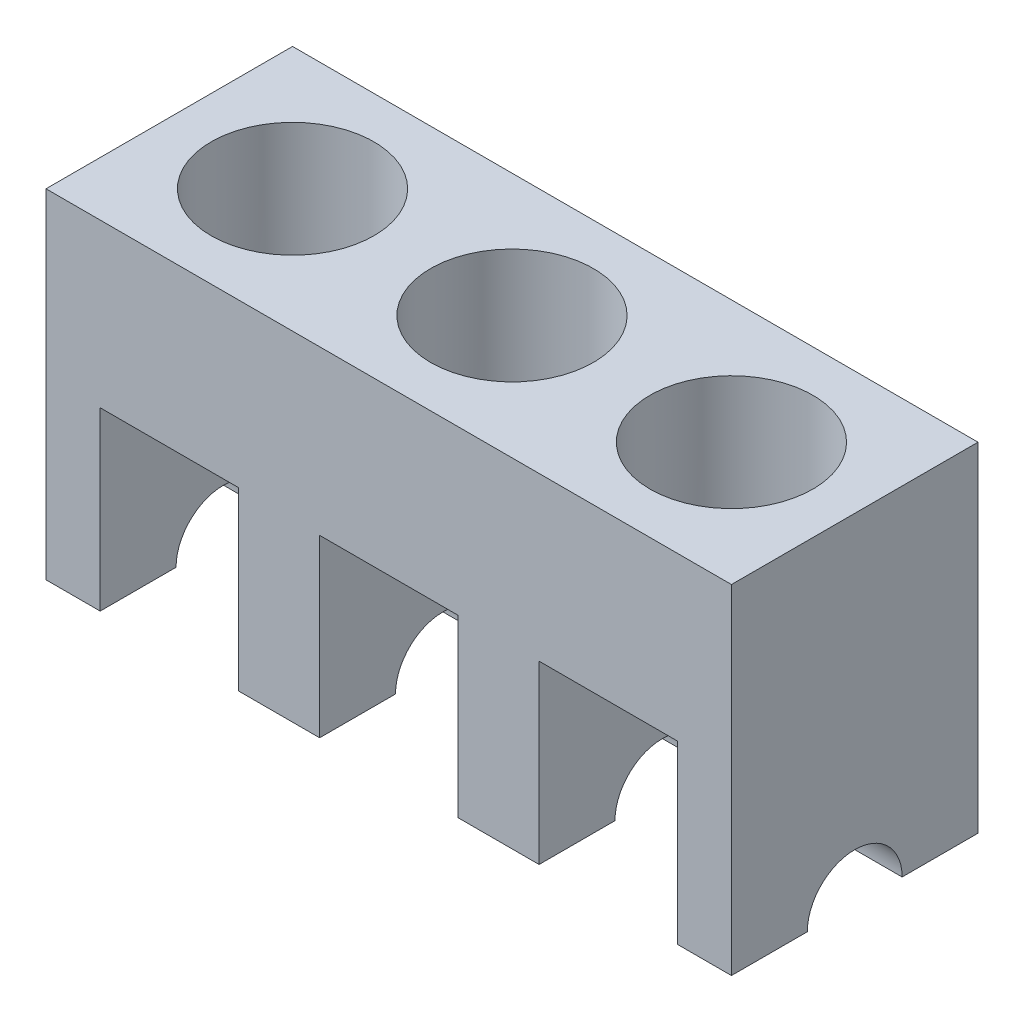
ISO-10303-21;
HEADER;
FILE_DESCRIPTION(('STEP AP214'),'2;1');
FILE_NAME('part.step','',(''),(''),'','','');
FILE_SCHEMA(('AUTOMOTIVE_DESIGN { 1 0 10303 214 1 1 1 1 }'));
ENDSEC;
DATA;
#1=APPLICATION_CONTEXT('core data for automotive mechanical design processes');
#2=APPLICATION_PROTOCOL_DEFINITION('international standard','automotive_design',2000,#1);
#3=PRODUCT_CONTEXT('',#1,'mechanical');
#4=PRODUCT('Part','Part','',(#3));
#5=PRODUCT_RELATED_PRODUCT_CATEGORY('part','',(#4));
#6=PRODUCT_DEFINITION_FORMATION('','',#4);
#7=PRODUCT_DEFINITION_CONTEXT('part definition',#1,'design');
#8=PRODUCT_DEFINITION('design','',#6,#7);
#9=PRODUCT_DEFINITION_SHAPE('','',#8);
#10=(LENGTH_UNIT() NAMED_UNIT(*) SI_UNIT(.MILLI.,.METRE.));
#11=(NAMED_UNIT(*) PLANE_ANGLE_UNIT() SI_UNIT($,.RADIAN.));
#12=(NAMED_UNIT(*) SI_UNIT($,.STERADIAN.) SOLID_ANGLE_UNIT());
#13=UNCERTAINTY_MEASURE_WITH_UNIT(LENGTH_MEASURE(1.E-05),#10,'distance_accuracy_value','');
#14=(GEOMETRIC_REPRESENTATION_CONTEXT(3) GLOBAL_UNCERTAINTY_ASSIGNED_CONTEXT((#13)) GLOBAL_UNIT_ASSIGNED_CONTEXT((#10,
#11,#12)) REPRESENTATION_CONTEXT('',''));
#15=CARTESIAN_POINT('',(0.,0.,0.));
#16=DIRECTION('',(0.,0.,1.));
#17=DIRECTION('',(1.,0.,0.));
#18=AXIS2_PLACEMENT_3D('',#15,#16,#17);
#19=CARTESIAN_POINT('',(0.,0.,0.));
#20=DIRECTION('',(0.,1.,0.));
#21=DIRECTION('',(0.,0.,1.));
#22=AXIS2_PLACEMENT_3D('',#19,#20,#21);
#23=PLANE('',#22);
#24=DIRECTION('',(0.,0.,1.));
#25=VECTOR('',#24,1.);
#26=CARTESIAN_POINT('',(-56.7788309636654,0.,-2284.41500789889));
#27=LINE('',#26,#25);
#28=CARTESIAN_POINT('',(-56.7788309636654,0.,-684.215007898894));
#29=VERTEX_POINT('',#28);
#30=CARTESIAN_POINT('',(-56.7788309636651,0.,26.9849921011058));
#31=VERTEX_POINT('',#30);
#32=EDGE_CURVE('E301',#29,#31,#27,.T.);
#33=ORIENTED_EDGE('',*,*,#32,.F.);
#34=DIRECTION('',(1.,0.,0.));
#35=VECTOR('',#34,1.);
#36=CARTESIAN_POINT('',(-56.7788309636654,0.,-684.215007898894));
#37=LINE('',#36,#35);
#38=CARTESIAN_POINT('',(451.221169036335,0.,-684.215007898894));
#39=VERTEX_POINT('',#38);
#40=EDGE_CURVE('E281',#29,#39,#37,.T.);
#41=ORIENTED_EDGE('',*,*,#40,.T.);
#42=DIRECTION('',(0.,0.,1.));
#43=VECTOR('',#42,1.);
#44=CARTESIAN_POINT('',(451.221169036335,0.,-2284.41500789889));
#45=LINE('',#44,#43);
#46=CARTESIAN_POINT('',(451.221169036335,0.,26.9849921011058));
#47=VERTEX_POINT('',#46);
#48=EDGE_CURVE('E566',#39,#47,#45,.T.);
#49=ORIENTED_EDGE('',*,*,#48,.T.);
#50=DIRECTION('',(1.,0.,0.));
#51=VECTOR('',#50,1.);
#52=CARTESIAN_POINT('',(-56.7788309636651,0.,26.9849921011058));
#53=LINE('',#52,#51);
#54=EDGE_CURVE('E305',#31,#47,#53,.T.);
#55=ORIENTED_EDGE('',*,*,#54,.F.);
#56=EDGE_LOOP('',(#33,#41,#49,#55));
#57=FACE_BOUND('',#56,.T.);
#58=ADVANCED_FACE('F47',(#57),#23,.F.);
#59=DIRECTION('',(0.,0.,1.));
#60=VECTOR('',#59,1.);
#61=CARTESIAN_POINT('',(1746.62116903633,0.,-2284.41500789889));
#62=LINE('',#61,#60);
#63=CARTESIAN_POINT('',(1746.62116903633,0.,-684.215007898894));
#64=VERTEX_POINT('',#63);
#65=CARTESIAN_POINT('',(1746.62116903633,0.,26.9849921011058));
#66=VERTEX_POINT('',#65);
#67=EDGE_CURVE('E552',#64,#66,#62,.T.);
#68=ORIENTED_EDGE('',*,*,#67,.F.);
#69=DIRECTION('',(1.,0.,0.));
#70=VECTOR('',#69,1.);
#71=CARTESIAN_POINT('',(-56.7788309636654,0.,-684.215007898894));
#72=LINE('',#71,#70);
#73=CARTESIAN_POINT('',(2508.62116903633,0.,-684.215007898894));
#74=VERTEX_POINT('',#73);
#75=EDGE_CURVE('E554',#64,#74,#72,.T.);
#76=ORIENTED_EDGE('',*,*,#75,.T.);
#77=DIRECTION('',(0.,0.,1.));
#78=VECTOR('',#77,1.);
#79=CARTESIAN_POINT('',(2508.62116903633,0.,0.));
#80=LINE('',#79,#78);
#81=CARTESIAN_POINT('',(2508.62116903633,0.,26.9849921011058));
#82=VERTEX_POINT('',#81);
#83=EDGE_CURVE('E426',#74,#82,#80,.T.);
#84=ORIENTED_EDGE('',*,*,#83,.T.);
#85=EDGE_CURVE('E312',#66,#82,#53,.T.);
#86=ORIENTED_EDGE('',*,*,#85,.F.);
#87=EDGE_LOOP('',(#68,#76,#84,#86));
#88=FACE_BOUND('',#87,.T.);
#89=ADVANCED_FACE('F550',(#88),#23,.F.);
#90=DIRECTION('',(0.,0.,-1.));
#91=VECTOR('',#90,1.);
#92=CARTESIAN_POINT('',(3804.02116903633,0.,0.));
#93=LINE('',#92,#91);
#94=CARTESIAN_POINT('',(3804.02116903633,0.,26.9849921011058));
#95=VERTEX_POINT('',#94);
#96=CARTESIAN_POINT('',(3804.02116903633,0.,-684.215007898894));
#97=VERTEX_POINT('',#96);
#98=EDGE_CURVE('E417',#95,#97,#93,.T.);
#99=ORIENTED_EDGE('',*,*,#98,.T.);
#100=DIRECTION('',(1.,0.,0.));
#101=VECTOR('',#100,1.);
#102=CARTESIAN_POINT('',(-56.7788309636654,0.,-684.215007898894));
#103=LINE('',#102,#101);
#104=CARTESIAN_POINT('',(4566.02116903633,0.,-684.215007898894));
#105=VERTEX_POINT('',#104);
#106=EDGE_CURVE('E532',#97,#105,#103,.T.);
#107=ORIENTED_EDGE('',*,*,#106,.T.);
#108=DIRECTION('',(0.,0.,1.));
#109=VECTOR('',#108,1.);
#110=CARTESIAN_POINT('',(4566.02116903633,0.,-2284.41500789889));
#111=LINE('',#110,#109);
#112=CARTESIAN_POINT('',(4566.02116903633,0.,26.9849921011058));
#113=VERTEX_POINT('',#112);
#114=EDGE_CURVE('E396',#105,#113,#111,.T.);
#115=ORIENTED_EDGE('',*,*,#114,.T.);
#116=EDGE_CURVE('E303',#95,#113,#53,.T.);
#117=ORIENTED_EDGE('',*,*,#116,.F.);
#118=EDGE_LOOP('',(#99,#107,#115,#117));
#119=FACE_BOUND('',#118,.T.);
#120=ADVANCED_FACE('F530',(#119),#23,.F.);
#121=DIRECTION('',(0.,0.,1.));
#122=VECTOR('',#121,1.);
#123=CARTESIAN_POINT('',(5861.42116903634,0.,-2284.41500789889));
#124=LINE('',#123,#122);
#125=CARTESIAN_POINT('',(5861.42116903634,0.,-684.215007898894));
#126=VERTEX_POINT('',#125);
#127=CARTESIAN_POINT('',(5861.42116903634,0.,26.9849921011058));
#128=VERTEX_POINT('',#127);
#129=EDGE_CURVE('E392',#126,#128,#124,.T.);
#130=ORIENTED_EDGE('',*,*,#129,.F.);
#131=DIRECTION('',(1.,0.,0.));
#132=VECTOR('',#131,1.);
#133=CARTESIAN_POINT('',(-56.7788309636654,0.,-684.215007898894));
#134=LINE('',#133,#132);
#135=CARTESIAN_POINT('',(6369.42116903633,0.,-684.215007898894));
#136=VERTEX_POINT('',#135);
#137=EDGE_CURVE('E606',#126,#136,#134,.T.);
#138=ORIENTED_EDGE('',*,*,#137,.T.);
#139=DIRECTION('',(0.,0.,-1.));
#140=VECTOR('',#139,1.);
#141=CARTESIAN_POINT('',(6369.42116903633,0.,26.9849921011058));
#142=LINE('',#141,#140);
#143=CARTESIAN_POINT('',(6369.42116903633,0.,26.9849921011058));
#144=VERTEX_POINT('',#143);
#145=EDGE_CURVE('E313',#144,#136,#142,.T.);
#146=ORIENTED_EDGE('',*,*,#145,.F.);
#147=EDGE_CURVE('E300',#128,#144,#53,.T.);
#148=ORIENTED_EDGE('',*,*,#147,.F.);
#149=EDGE_LOOP('',(#130,#138,#146,#148));
#150=FACE_BOUND('',#149,.T.);
#151=ADVANCED_FACE('F658',(#150),#23,.F.);
#152=CARTESIAN_POINT('',(451.221169036335,0.,-2284.41500789889));
#153=VERTEX_POINT('',#152);
#154=CARTESIAN_POINT('',(451.221169036335,0.,-1573.21500789889));
#155=VERTEX_POINT('',#154);
#156=EDGE_CURVE('E294',#153,#155,#45,.T.);
#157=ORIENTED_EDGE('',*,*,#156,.T.);
#158=DIRECTION('',(1.,0.,0.));
#159=VECTOR('',#158,1.);
#160=CARTESIAN_POINT('',(-56.7788309636654,0.,-1573.21500789889));
#161=LINE('',#160,#159);
#162=CARTESIAN_POINT('',(-56.7788309636654,0.,-1573.21500789889));
#163=VERTEX_POINT('',#162);
#164=EDGE_CURVE('E62',#155,#163,#161,.F.);
#165=ORIENTED_EDGE('',*,*,#164,.T.);
#166=CARTESIAN_POINT('',(-56.7788309636654,0.,-2284.41500789889));
#167=VERTEX_POINT('',#166);
#168=EDGE_CURVE('E292',#167,#163,#27,.T.);
#169=ORIENTED_EDGE('',*,*,#168,.F.);
#170=DIRECTION('',(-1.,0.,0.));
#171=VECTOR('',#170,1.);
#172=CARTESIAN_POINT('',(6369.42116903633,0.,-2284.41500789889));
#173=LINE('',#172,#171);
#174=EDGE_CURVE('E445',#153,#167,#173,.T.);
#175=ORIENTED_EDGE('',*,*,#174,.F.);
#176=EDGE_LOOP('',(#157,#165,#169,#175));
#177=FACE_BOUND('',#176,.T.);
#178=ADVANCED_FACE('F290',(#177),#23,.F.);
#179=CARTESIAN_POINT('',(2508.62116903633,0.,-2284.41500789889));
#180=VERTEX_POINT('',#179);
#181=CARTESIAN_POINT('',(2508.62116903633,0.,-1573.21500789889));
#182=VERTEX_POINT('',#181);
#183=EDGE_CURVE('E427',#180,#182,#80,.T.);
#184=ORIENTED_EDGE('',*,*,#183,.T.);
#185=DIRECTION('',(1.,0.,0.));
#186=VECTOR('',#185,1.);
#187=CARTESIAN_POINT('',(-56.7788309636654,0.,-1573.21500789889));
#188=LINE('',#187,#186);
#189=CARTESIAN_POINT('',(1746.62116903633,0.,-1573.21500789889));
#190=VERTEX_POINT('',#189);
#191=EDGE_CURVE('E70',#182,#190,#188,.F.);
#192=ORIENTED_EDGE('',*,*,#191,.T.);
#193=CARTESIAN_POINT('',(1746.62116903633,0.,-2284.41500789889));
#194=VERTEX_POINT('',#193);
#195=EDGE_CURVE('E567',#194,#190,#62,.T.);
#196=ORIENTED_EDGE('',*,*,#195,.F.);
#197=EDGE_CURVE('E480',#180,#194,#173,.T.);
#198=ORIENTED_EDGE('',*,*,#197,.F.);
#199=EDGE_LOOP('',(#184,#192,#196,#198));
#200=FACE_BOUND('',#199,.T.);
#201=ADVANCED_FACE('F650',(#200),#23,.F.);
#202=CARTESIAN_POINT('',(4566.02116903633,0.,-2284.41500789889));
#203=VERTEX_POINT('',#202);
#204=CARTESIAN_POINT('',(4566.02116903633,0.,-1573.21500789889));
#205=VERTEX_POINT('',#204);
#206=EDGE_CURVE('E393',#203,#205,#111,.T.);
#207=ORIENTED_EDGE('',*,*,#206,.T.);
#208=DIRECTION('',(1.,0.,0.));
#209=VECTOR('',#208,1.);
#210=CARTESIAN_POINT('',(-56.7788309636654,0.,-1573.21500789889));
#211=LINE('',#210,#209);
#212=CARTESIAN_POINT('',(3804.02116903633,0.,-1573.21500789889));
#213=VERTEX_POINT('',#212);
#214=EDGE_CURVE('E494',#205,#213,#211,.F.);
#215=ORIENTED_EDGE('',*,*,#214,.T.);
#216=CARTESIAN_POINT('',(3804.02116903633,0.,-2284.41500789889));
#217=VERTEX_POINT('',#216);
#218=EDGE_CURVE('E416',#213,#217,#93,.T.);
#219=ORIENTED_EDGE('',*,*,#218,.T.);
#220=EDGE_CURVE('E482',#203,#217,#173,.T.);
#221=ORIENTED_EDGE('',*,*,#220,.F.);
#222=EDGE_LOOP('',(#207,#215,#219,#221));
#223=FACE_BOUND('',#222,.T.);
#224=ADVANCED_FACE('F491',(#223),#23,.F.);
#225=CARTESIAN_POINT('',(0.,1117.6,0.));
#226=DIRECTION('',(0.,1.,0.));
#227=DIRECTION('',(0.,0.,1.));
#228=AXIS2_PLACEMENT_3D('',#225,#226,#227);
#229=PLANE('',#228);
#230=DIRECTION('',(0.,0.,1.));
#231=VECTOR('',#230,1.);
#232=CARTESIAN_POINT('',(4566.02116903633,1117.6,0.));
#233=LINE('',#232,#231);
#234=CARTESIAN_POINT('',(4566.02116903633,1117.6,-1532.52907761415));
#235=VERTEX_POINT('',#234);
#236=CARTESIAN_POINT('',(4566.02116903633,1117.6,-724.900938183634));
#237=VERTEX_POINT('',#236);
#238=EDGE_CURVE('E346',#235,#237,#233,.T.);
#239=ORIENTED_EDGE('',*,*,#238,.F.);
#240=CARTESIAN_POINT('',(5213.72116903633,1117.6,-1128.71500789889));
#241=DIRECTION('',(0.,1.,0.));
#242=DIRECTION('',(0.,0.,1.));
#243=AXIS2_PLACEMENT_3D('',#240,#241,#242);
#244=CIRCLE('',#243,763.27);
#245=EDGE_CURVE('E450',#237,#235,#244,.F.);
#246=ORIENTED_EDGE('',*,*,#245,.F.);
#247=EDGE_LOOP('',(#239,#246));
#248=FACE_BOUND('',#247,.T.);
#249=ADVANCED_FACE('F624',(#248),#229,.T.);
#250=CARTESIAN_POINT('',(0.,1117.6,0.));
#251=DIRECTION('',(0.,1.,0.));
#252=DIRECTION('',(0.,0.,1.));
#253=AXIS2_PLACEMENT_3D('',#250,#251,#252);
#254=PLANE('',#253);
#255=DIRECTION('',(0.,0.,1.));
#256=VECTOR('',#255,1.);
#257=CARTESIAN_POINT('',(2508.62116903633,1117.6,0.));
#258=LINE('',#257,#256);
#259=CARTESIAN_POINT('',(2508.62116903633,1117.6,-1532.52907761415));
#260=VERTEX_POINT('',#259);
#261=CARTESIAN_POINT('',(2508.62116903633,1117.6,-724.900938183634));
#262=VERTEX_POINT('',#261);
#263=EDGE_CURVE('E338',#260,#262,#258,.T.);
#264=ORIENTED_EDGE('',*,*,#263,.F.);
#265=CARTESIAN_POINT('',(3156.32116903633,1117.6,-1128.71500789889));
#266=DIRECTION('',(0.,1.,0.));
#267=DIRECTION('',(0.,0.,1.));
#268=AXIS2_PLACEMENT_3D('',#265,#266,#267);
#269=CIRCLE('',#268,763.27);
#270=EDGE_CURVE('E441',#262,#260,#269,.F.);
#271=ORIENTED_EDGE('',*,*,#270,.F.);
#272=EDGE_LOOP('',(#264,#271));
#273=FACE_BOUND('',#272,.T.);
#274=ADVANCED_FACE('F634',(#273),#254,.T.);
#275=CARTESIAN_POINT('',(0.,1117.6,0.));
#276=DIRECTION('',(0.,1.,0.));
#277=DIRECTION('',(0.,0.,1.));
#278=AXIS2_PLACEMENT_3D('',#275,#276,#277);
#279=PLANE('',#278);
#280=DIRECTION('',(0.,0.,1.));
#281=VECTOR('',#280,1.);
#282=CARTESIAN_POINT('',(451.221169036335,1117.6,0.));
#283=LINE('',#282,#281);
#284=CARTESIAN_POINT('',(451.221169036335,1117.6,-1532.52907761415));
#285=VERTEX_POINT('',#284);
#286=CARTESIAN_POINT('',(451.221169036335,1117.6,-724.900938183634));
#287=VERTEX_POINT('',#286);
#288=EDGE_CURVE('E330',#285,#287,#283,.T.);
#289=ORIENTED_EDGE('',*,*,#288,.F.);
#290=CARTESIAN_POINT('',(1098.92116903633,1117.6,-1128.71500789889));
#291=DIRECTION('',(0.,1.,0.));
#292=DIRECTION('',(0.,0.,1.));
#293=AXIS2_PLACEMENT_3D('',#290,#291,#292);
#294=CIRCLE('',#293,763.27);
#295=EDGE_CURVE('E442',#287,#285,#294,.F.);
#296=ORIENTED_EDGE('',*,*,#295,.F.);
#297=EDGE_LOOP('',(#289,#296));
#298=FACE_BOUND('',#297,.T.);
#299=ADVANCED_FACE('F670',(#298),#279,.T.);
#300=CARTESIAN_POINT('',(6369.42116903633,3175.,-2284.41500789889));
#301=DIRECTION('',(0.,0.,1.));
#302=DIRECTION('',(1.,0.,0.));
#303=AXIS2_PLACEMENT_3D('',#300,#301,#302);
#304=PLANE('',#303);
#305=DIRECTION('',(-1.,0.,0.));
#306=VECTOR('',#305,1.);
#307=CARTESIAN_POINT('',(451.221169036335,1651.,-2284.41500789889));
#308=LINE('',#307,#306);
#309=CARTESIAN_POINT('',(1746.62116903633,1651.,-2284.41500789889));
#310=VERTEX_POINT('',#309);
#311=CARTESIAN_POINT('',(451.221169036335,1651.,-2284.41500789889));
#312=VERTEX_POINT('',#311);
#313=EDGE_CURVE('E577',#310,#312,#308,.T.);
#314=ORIENTED_EDGE('',*,*,#313,.T.);
#315=DIRECTION('',(0.,-1.,0.));
#316=VECTOR('',#315,1.);
#317=CARTESIAN_POINT('',(451.221169036335,0.,-2284.41500789889));
#318=LINE('',#317,#316);
#319=EDGE_CURVE('E479',#312,#153,#318,.T.);
#320=ORIENTED_EDGE('',*,*,#319,.T.);
#321=ORIENTED_EDGE('',*,*,#174,.T.);
#322=DIRECTION('',(0.,-1.,0.));
#323=VECTOR('',#322,1.);
#324=CARTESIAN_POINT('',(-56.7788309636654,3175.,-2284.41500789889));
#325=LINE('',#324,#323);
#326=CARTESIAN_POINT('',(-56.7788309636654,3175.,-2284.41500789889));
#327=VERTEX_POINT('',#326);
#328=EDGE_CURVE('E299',#327,#167,#325,.T.);
#329=ORIENTED_EDGE('',*,*,#328,.F.);
#330=DIRECTION('',(-1.,0.,0.));
#331=VECTOR('',#330,1.);
#332=CARTESIAN_POINT('',(6369.42116903633,3175.,-2284.41500789889));
#333=LINE('',#332,#331);
#334=CARTESIAN_POINT('',(6369.42116903633,3175.,-2284.41500789889));
#335=VERTEX_POINT('',#334);
#336=EDGE_CURVE('E316',#335,#327,#333,.T.);
#337=ORIENTED_EDGE('',*,*,#336,.F.);
#338=DIRECTION('',(0.,-1.,0.));
#339=VECTOR('',#338,1.);
#340=CARTESIAN_POINT('',(6369.42116903633,3175.,-2284.41500789889));
#341=LINE('',#340,#339);
#342=CARTESIAN_POINT('',(6369.42116903633,0.,-2284.41500789889));
#343=VERTEX_POINT('',#342);
#344=EDGE_CURVE('E317',#335,#343,#341,.T.);
#345=ORIENTED_EDGE('',*,*,#344,.T.);
#346=CARTESIAN_POINT('',(5861.42116903634,0.,-2284.41500789889));
#347=VERTEX_POINT('',#346);
#348=EDGE_CURVE('E306',#343,#347,#173,.T.);
#349=ORIENTED_EDGE('',*,*,#348,.T.);
#350=DIRECTION('',(0.,1.,0.));
#351=VECTOR('',#350,1.);
#352=CARTESIAN_POINT('',(5861.42116903634,0.,-2284.41500789889));
#353=LINE('',#352,#351);
#354=CARTESIAN_POINT('',(5861.42116903634,1651.,-2284.41500789889));
#355=VERTEX_POINT('',#354);
#356=EDGE_CURVE('E526',#347,#355,#353,.T.);
#357=ORIENTED_EDGE('',*,*,#356,.T.);
#358=DIRECTION('',(-1.,0.,0.));
#359=VECTOR('',#358,1.);
#360=CARTESIAN_POINT('',(4566.02116903633,1651.,-2284.41500789889));
#361=LINE('',#360,#359);
#362=CARTESIAN_POINT('',(4566.02116903633,1651.,-2284.41500789889));
#363=VERTEX_POINT('',#362);
#364=EDGE_CURVE('E385',#355,#363,#361,.T.);
#365=ORIENTED_EDGE('',*,*,#364,.T.);
#366=DIRECTION('',(0.,-1.,0.));
#367=VECTOR('',#366,1.);
#368=CARTESIAN_POINT('',(4566.02116903633,0.,-2284.41500789889));
#369=LINE('',#368,#367);
#370=EDGE_CURVE('E375',#363,#203,#369,.T.);
#371=ORIENTED_EDGE('',*,*,#370,.T.);
#372=ORIENTED_EDGE('',*,*,#220,.T.);
#373=DIRECTION('',(0.,1.,0.));
#374=VECTOR('',#373,1.);
#375=CARTESIAN_POINT('',(3804.02116903633,-7.15828160284104,-2284.41500789889));
#376=LINE('',#375,#374);
#377=CARTESIAN_POINT('',(3804.02116903633,1643.84171839716,-2284.41500789889));
#378=VERTEX_POINT('',#377);
#379=EDGE_CURVE('E489',#217,#378,#376,.T.);
#380=ORIENTED_EDGE('',*,*,#379,.T.);
#381=DIRECTION('',(-1.,0.,0.));
#382=VECTOR('',#381,1.);
#383=CARTESIAN_POINT('',(2508.62116903633,1643.84171839716,-2284.41500789889));
#384=LINE('',#383,#382);
#385=CARTESIAN_POINT('',(2508.62116903633,1643.84171839716,-2284.41500789889));
#386=VERTEX_POINT('',#385);
#387=EDGE_CURVE('E501',#378,#386,#384,.T.);
#388=ORIENTED_EDGE('',*,*,#387,.T.);
#389=DIRECTION('',(0.,-1.,0.));
#390=VECTOR('',#389,1.);
#391=CARTESIAN_POINT('',(2508.62116903633,-7.15828160284104,-2284.41500789889));
#392=LINE('',#391,#390);
#393=EDGE_CURVE('E502',#386,#180,#392,.T.);
#394=ORIENTED_EDGE('',*,*,#393,.T.);
#395=ORIENTED_EDGE('',*,*,#197,.T.);
#396=DIRECTION('',(0.,1.,0.));
#397=VECTOR('',#396,1.);
#398=CARTESIAN_POINT('',(1746.62116903633,0.,-2284.41500789889));
#399=LINE('',#398,#397);
#400=EDGE_CURVE('E579',#194,#310,#399,.T.);
#401=ORIENTED_EDGE('',*,*,#400,.T.);
#402=EDGE_LOOP('',(#314,#320,#321,#329,#337,#345,#349,#357,#365,#371,#372,#380,#388,#394,#395,#401));
#403=FACE_BOUND('',#402,.T.);
#404=ADVANCED_FACE('F49',(#403),#304,.F.);
#405=CARTESIAN_POINT('',(-56.7788309636654,3175.,-2284.41500789889));
#406=DIRECTION('',(1.,0.,0.));
#407=DIRECTION('',(0.,0.,-1.));
#408=AXIS2_PLACEMENT_3D('',#405,#406,#407);
#409=PLANE('',#408);
#410=ORIENTED_EDGE('',*,*,#168,.T.);
#411=CARTESIAN_POINT('',(-56.7788309636654,0.,-1128.71500789889));
#412=DIRECTION('',(1.,0.,0.));
#413=DIRECTION('',(0.,0.,-1.));
#414=AXIS2_PLACEMENT_3D('',#411,#412,#413);
#415=CIRCLE('',#414,444.5);
#416=EDGE_CURVE('E278',#163,#29,#415,.T.);
#417=ORIENTED_EDGE('',*,*,#416,.T.);
#418=ORIENTED_EDGE('',*,*,#32,.T.);
#419=DIRECTION('',(0.,-1.,0.));
#420=VECTOR('',#419,1.);
#421=CARTESIAN_POINT('',(-56.7788309636651,3175.,26.9849921011058));
#422=LINE('',#421,#420);
#423=CARTESIAN_POINT('',(-56.7788309636651,3175.,26.9849921011058));
#424=VERTEX_POINT('',#423);
#425=EDGE_CURVE('E324',#424,#31,#422,.T.);
#426=ORIENTED_EDGE('',*,*,#425,.F.);
#427=DIRECTION('',(0.,0.,1.));
#428=VECTOR('',#427,1.);
#429=CARTESIAN_POINT('',(-56.7788309636654,3175.,-2284.41500789889));
#430=LINE('',#429,#428);
#431=EDGE_CURVE('E459',#327,#424,#430,.T.);
#432=ORIENTED_EDGE('',*,*,#431,.F.);
#433=ORIENTED_EDGE('',*,*,#328,.T.);
#434=EDGE_LOOP('',(#410,#417,#418,#426,#432,#433));
#435=FACE_BOUND('',#434,.T.);
#436=ADVANCED_FACE('F297',(#435),#409,.F.);
#437=CARTESIAN_POINT('',(-56.7788309636651,3175.,26.9849921011058));
#438=DIRECTION('',(0.,0.,-1.));
#439=DIRECTION('',(-1.,0.,0.));
#440=AXIS2_PLACEMENT_3D('',#437,#438,#439);
#441=PLANE('',#440);
#442=ORIENTED_EDGE('',*,*,#54,.T.);
#443=DIRECTION('',(0.,-1.,0.));
#444=VECTOR('',#443,1.);
#445=CARTESIAN_POINT('',(451.221169036335,0.,26.9849921011058));
#446=LINE('',#445,#444);
#447=CARTESIAN_POINT('',(451.221169036335,1651.,26.9849921011058));
#448=VERTEX_POINT('',#447);
#449=EDGE_CURVE('E514',#448,#47,#446,.T.);
#450=ORIENTED_EDGE('',*,*,#449,.F.);
#451=DIRECTION('',(-1.,0.,0.));
#452=VECTOR('',#451,1.);
#453=CARTESIAN_POINT('',(451.221169036335,1651.,26.9849921011058));
#454=LINE('',#453,#452);
#455=CARTESIAN_POINT('',(1746.62116903633,1651.,26.9849921011058));
#456=VERTEX_POINT('',#455);
#457=EDGE_CURVE('E583',#456,#448,#454,.T.);
#458=ORIENTED_EDGE('',*,*,#457,.F.);
#459=DIRECTION('',(0.,1.,0.));
#460=VECTOR('',#459,1.);
#461=CARTESIAN_POINT('',(1746.62116903633,0.,26.9849921011058));
#462=LINE('',#461,#460);
#463=EDGE_CURVE('E547',#66,#456,#462,.T.);
#464=ORIENTED_EDGE('',*,*,#463,.F.);
#465=ORIENTED_EDGE('',*,*,#85,.T.);
#466=DIRECTION('',(0.,-1.,0.));
#467=VECTOR('',#466,1.);
#468=CARTESIAN_POINT('',(2508.62116903633,-7.15828160284104,26.9849921011058));
#469=LINE('',#468,#467);
#470=CARTESIAN_POINT('',(2508.62116903633,1643.84171839716,26.9849921011058));
#471=VERTEX_POINT('',#470);
#472=EDGE_CURVE('E377',#471,#82,#469,.T.);
#473=ORIENTED_EDGE('',*,*,#472,.F.);
#474=DIRECTION('',(-1.,0.,0.));
#475=VECTOR('',#474,1.);
#476=CARTESIAN_POINT('',(2508.62116903633,1643.84171839716,26.9849921011058));
#477=LINE('',#476,#475);
#478=CARTESIAN_POINT('',(3804.02116903633,1643.84171839716,26.9849921011058));
#479=VERTEX_POINT('',#478);
#480=EDGE_CURVE('E507',#479,#471,#477,.T.);
#481=ORIENTED_EDGE('',*,*,#480,.F.);
#482=DIRECTION('',(0.,1.,0.));
#483=VECTOR('',#482,1.);
#484=CARTESIAN_POINT('',(3804.02116903633,-7.15828160284104,26.9849921011058));
#485=LINE('',#484,#483);
#486=EDGE_CURVE('E381',#95,#479,#485,.T.);
#487=ORIENTED_EDGE('',*,*,#486,.F.);
#488=ORIENTED_EDGE('',*,*,#116,.T.);
#489=DIRECTION('',(0.,-1.,0.));
#490=VECTOR('',#489,1.);
#491=CARTESIAN_POINT('',(4566.02116903633,0.,26.9849921011058));
#492=LINE('',#491,#490);
#493=CARTESIAN_POINT('',(4566.02116903633,1651.,26.9849921011058));
#494=VERTEX_POINT('',#493);
#495=EDGE_CURVE('E517',#494,#113,#492,.T.);
#496=ORIENTED_EDGE('',*,*,#495,.F.);
#497=DIRECTION('',(-1.,0.,0.));
#498=VECTOR('',#497,1.);
#499=CARTESIAN_POINT('',(4566.02116903633,1651.,26.9849921011058));
#500=LINE('',#499,#498);
#501=CARTESIAN_POINT('',(5861.42116903634,1651.,26.9849921011058));
#502=VERTEX_POINT('',#501);
#503=EDGE_CURVE('E523',#502,#494,#500,.T.);
#504=ORIENTED_EDGE('',*,*,#503,.F.);
#505=DIRECTION('',(0.,1.,0.));
#506=VECTOR('',#505,1.);
#507=CARTESIAN_POINT('',(5861.42116903634,0.,26.9849921011058));
#508=LINE('',#507,#506);
#509=EDGE_CURVE('E520',#128,#502,#508,.T.);
#510=ORIENTED_EDGE('',*,*,#509,.F.);
#511=ORIENTED_EDGE('',*,*,#147,.T.);
#512=DIRECTION('',(0.,-1.,0.));
#513=VECTOR('',#512,1.);
#514=CARTESIAN_POINT('',(6369.42116903633,3175.,26.9849921011058));
#515=LINE('',#514,#513);
#516=CARTESIAN_POINT('',(6369.42116903633,3175.,26.9849921011058));
#517=VERTEX_POINT('',#516);
#518=EDGE_CURVE('E320',#517,#144,#515,.T.);
#519=ORIENTED_EDGE('',*,*,#518,.F.);
#520=DIRECTION('',(1.,0.,0.));
#521=VECTOR('',#520,1.);
#522=CARTESIAN_POINT('',(-56.7788309636651,3175.,26.9849921011058));
#523=LINE('',#522,#521);
#524=EDGE_CURVE('E461',#424,#517,#523,.T.);
#525=ORIENTED_EDGE('',*,*,#524,.F.);
#526=ORIENTED_EDGE('',*,*,#425,.T.);
#527=EDGE_LOOP('',(#442,#450,#458,#464,#465,#473,#481,#487,#488,#496,#504,#510,#511,#519,#525,#526));
#528=FACE_BOUND('',#527,.T.);
#529=ADVANCED_FACE('F539',(#528),#441,.F.);
#530=CARTESIAN_POINT('',(6369.42116903633,3175.,26.9849921011058));
#531=DIRECTION('',(-1.,0.,0.));
#532=DIRECTION('',(0.,0.,1.));
#533=AXIS2_PLACEMENT_3D('',#530,#531,#532);
#534=PLANE('',#533);
#535=ORIENTED_EDGE('',*,*,#145,.T.);
#536=CARTESIAN_POINT('',(6369.42116903633,0.,-1128.71500789889));
#537=DIRECTION('',(-1.,0.,0.));
#538=DIRECTION('',(0.,0.,1.));
#539=AXIS2_PLACEMENT_3D('',#536,#537,#538);
#540=CIRCLE('',#539,444.5);
#541=CARTESIAN_POINT('',(6369.42116903633,0.,-1573.21500789889));
#542=VERTEX_POINT('',#541);
#543=EDGE_CURVE('E604',#136,#542,#540,.T.);
#544=ORIENTED_EDGE('',*,*,#543,.T.);
#545=EDGE_CURVE('E311',#542,#343,#142,.T.);
#546=ORIENTED_EDGE('',*,*,#545,.T.);
#547=ORIENTED_EDGE('',*,*,#344,.F.);
#548=DIRECTION('',(0.,0.,-1.));
#549=VECTOR('',#548,1.);
#550=CARTESIAN_POINT('',(6369.42116903633,3175.,26.9849921011058));
#551=LINE('',#550,#549);
#552=EDGE_CURVE('E321',#517,#335,#551,.T.);
#553=ORIENTED_EDGE('',*,*,#552,.F.);
#554=ORIENTED_EDGE('',*,*,#518,.T.);
#555=EDGE_LOOP('',(#535,#544,#546,#547,#553,#554));
#556=FACE_BOUND('',#555,.T.);
#557=ADVANCED_FACE('F470',(#556),#534,.F.);
#558=CARTESIAN_POINT('',(0.,3175.,0.));
#559=DIRECTION('',(0.,1.,0.));
#560=DIRECTION('',(0.,0.,1.));
#561=AXIS2_PLACEMENT_3D('',#558,#559,#560);
#562=PLANE('',#561);
#563=CARTESIAN_POINT('',(1098.92116903633,3175.,-1128.71500789889));
#564=DIRECTION('',(0.,1.,0.));
#565=DIRECTION('',(0.,0.,1.));
#566=AXIS2_PLACEMENT_3D('',#563,#564,#565);
#567=CIRCLE('',#566,763.27);
#568=CARTESIAN_POINT('',(1098.92116903633,3175.,-365.445007898894));
#569=VERTEX_POINT('',#568);
#570=EDGE_CURVE('E437',#569,#569,#567,.T.);
#571=ORIENTED_EDGE('',*,*,#570,.F.);
#572=EDGE_LOOP('',(#571));
#573=FACE_BOUND('',#572,.T.);
#574=CARTESIAN_POINT('',(3156.32116903633,3175.,-1128.71500789889));
#575=DIRECTION('',(0.,1.,0.));
#576=DIRECTION('',(0.,0.,1.));
#577=AXIS2_PLACEMENT_3D('',#574,#575,#576);
#578=CIRCLE('',#577,763.27);
#579=CARTESIAN_POINT('',(3156.32116903633,3175.,-365.445007898894));
#580=VERTEX_POINT('',#579);
#581=EDGE_CURVE('E446',#580,#580,#578,.T.);
#582=ORIENTED_EDGE('',*,*,#581,.F.);
#583=EDGE_LOOP('',(#582));
#584=FACE_BOUND('',#583,.T.);
#585=CARTESIAN_POINT('',(5213.72116903633,3175.,-1128.71500789889));
#586=DIRECTION('',(0.,1.,0.));
#587=DIRECTION('',(0.,0.,1.));
#588=AXIS2_PLACEMENT_3D('',#585,#586,#587);
#589=CIRCLE('',#588,763.27);
#590=CARTESIAN_POINT('',(5213.72116903633,3175.,-365.445007898894));
#591=VERTEX_POINT('',#590);
#592=EDGE_CURVE('E436',#591,#591,#589,.T.);
#593=ORIENTED_EDGE('',*,*,#592,.F.);
#594=EDGE_LOOP('',(#593));
#595=FACE_BOUND('',#594,.T.);
#596=ORIENTED_EDGE('',*,*,#336,.T.);
#597=ORIENTED_EDGE('',*,*,#431,.T.);
#598=ORIENTED_EDGE('',*,*,#524,.T.);
#599=ORIENTED_EDGE('',*,*,#552,.T.);
#600=EDGE_LOOP('',(#596,#597,#598,#599));
#601=FACE_BOUND('',#600,.T.);
#602=ADVANCED_FACE('F465',(#573,#584,#595,#601),#562,.T.);
#603=ORIENTED_EDGE('',*,*,#545,.F.);
#604=DIRECTION('',(1.,0.,0.));
#605=VECTOR('',#604,1.);
#606=CARTESIAN_POINT('',(-56.7788309636654,0.,-1573.21500789889));
#607=LINE('',#606,#605);
#608=CARTESIAN_POINT('',(5861.42116903634,0.,-1573.21500789889));
#609=VERTEX_POINT('',#608);
#610=EDGE_CURVE('E285',#542,#609,#607,.F.);
#611=ORIENTED_EDGE('',*,*,#610,.T.);
#612=EDGE_CURVE('E389',#347,#609,#124,.T.);
#613=ORIENTED_EDGE('',*,*,#612,.F.);
#614=ORIENTED_EDGE('',*,*,#348,.F.);
#615=EDGE_LOOP('',(#603,#611,#613,#614));
#616=FACE_BOUND('',#615,.T.);
#617=ADVANCED_FACE('F612',(#616),#23,.F.);
#618=CARTESIAN_POINT('',(5213.72116903633,-3098.65357150502,-1128.71500789889));
#619=DIRECTION('',(0.,1.,0.));
#620=DIRECTION('',(0.,0.,1.));
#621=AXIS2_PLACEMENT_3D('',#618,#619,#620);
#622=CYLINDRICAL_SURFACE('',#621,763.27);
#623=ORIENTED_EDGE('',*,*,#245,.T.);
#624=DIRECTION('',(0.,1.,0.));
#625=VECTOR('',#624,1.);
#626=CARTESIAN_POINT('',(4566.02116903633,-3098.65357150502,-1532.52907761415));
#627=LINE('',#626,#625);
#628=CARTESIAN_POINT('',(4566.02116903633,1651.,-1532.52907761415));
#629=VERTEX_POINT('',#628);
#630=EDGE_CURVE('E361',#235,#629,#627,.T.);
#631=ORIENTED_EDGE('',*,*,#630,.T.);
#632=CARTESIAN_POINT('',(5213.72116903633,1651.,-1128.71500789889));
#633=DIRECTION('',(0.,1.,0.));
#634=DIRECTION('',(0.,0.,1.));
#635=AXIS2_PLACEMENT_3D('',#632,#633,#634);
#636=CIRCLE('',#635,763.27);
#637=CARTESIAN_POINT('',(5861.42116903634,1651.,-1532.52907761415));
#638=VERTEX_POINT('',#637);
#639=EDGE_CURVE('E55',#629,#638,#636,.F.);
#640=ORIENTED_EDGE('',*,*,#639,.T.);
#641=DIRECTION('',(0.,1.,0.));
#642=VECTOR('',#641,1.);
#643=CARTESIAN_POINT('',(5861.42116903634,-3098.65357150502,-1532.52907761415));
#644=LINE('',#643,#642);
#645=CARTESIAN_POINT('',(5861.42116903634,1117.6,-1532.52907761415));
#646=VERTEX_POINT('',#645);
#647=EDGE_CURVE('E359',#638,#646,#644,.F.);
#648=ORIENTED_EDGE('',*,*,#647,.T.);
#649=CARTESIAN_POINT('',(5861.42116903634,1117.6,-724.900938183637));
#650=VERTEX_POINT('',#649);
#651=EDGE_CURVE('E455',#646,#650,#244,.F.);
#652=ORIENTED_EDGE('',*,*,#651,.T.);
#653=DIRECTION('',(0.,1.,0.));
#654=VECTOR('',#653,1.);
#655=CARTESIAN_POINT('',(5861.42116903634,-3098.65357150502,-724.900938183637));
#656=LINE('',#655,#654);
#657=CARTESIAN_POINT('',(5861.42116903634,1651.,-724.900938183637));
#658=VERTEX_POINT('',#657);
#659=EDGE_CURVE('E430',#650,#658,#656,.T.);
#660=ORIENTED_EDGE('',*,*,#659,.T.);
#661=CARTESIAN_POINT('',(4566.02116903633,1651.,-724.900938183634));
#662=VERTEX_POINT('',#661);
#663=EDGE_CURVE('E347',#658,#662,#636,.F.);
#664=ORIENTED_EDGE('',*,*,#663,.T.);
#665=DIRECTION('',(0.,1.,0.));
#666=VECTOR('',#665,1.);
#667=CARTESIAN_POINT('',(4566.02116903633,-3098.65357150502,-724.900938183634));
#668=LINE('',#667,#666);
#669=EDGE_CURVE('E434',#662,#237,#668,.F.);
#670=ORIENTED_EDGE('',*,*,#669,.T.);
#671=EDGE_LOOP('',(#623,#631,#640,#648,#652,#660,#664,#670));
#672=FACE_BOUND('',#671,.T.);
#673=ORIENTED_EDGE('',*,*,#592,.T.);
#674=EDGE_LOOP('',(#673));
#675=FACE_BOUND('',#674,.T.);
#676=ADVANCED_FACE('F356',(#672,#675),#622,.F.);
#677=DIRECTION('',(0.,0.,-1.));
#678=VECTOR('',#677,1.);
#679=CARTESIAN_POINT('',(5861.42116903634,1117.6,0.));
#680=LINE('',#679,#678);
#681=EDGE_CURVE('E344',#650,#646,#680,.T.);
#682=ORIENTED_EDGE('',*,*,#681,.F.);
#683=ORIENTED_EDGE('',*,*,#651,.F.);
#684=EDGE_LOOP('',(#682,#683));
#685=FACE_BOUND('',#684,.T.);
#686=ADVANCED_FACE('F620',(#685),#229,.T.);
#687=CARTESIAN_POINT('',(3156.32116903633,-3098.65357150502,-1128.71500789889));
#688=DIRECTION('',(0.,1.,0.));
#689=DIRECTION('',(0.,0.,1.));
#690=AXIS2_PLACEMENT_3D('',#687,#688,#689);
#691=CYLINDRICAL_SURFACE('',#690,763.27);
#692=ORIENTED_EDGE('',*,*,#270,.T.);
#693=DIRECTION('',(0.,1.,0.));
#694=VECTOR('',#693,1.);
#695=CARTESIAN_POINT('',(2508.62116903633,-3098.65357150502,-1532.52907761415));
#696=LINE('',#695,#694);
#697=CARTESIAN_POINT('',(2508.62116903633,1643.84171839716,-1532.52907761415));
#698=VERTEX_POINT('',#697);
#699=EDGE_CURVE('E420',#260,#698,#696,.T.);
#700=ORIENTED_EDGE('',*,*,#699,.T.);
#701=CARTESIAN_POINT('',(3156.32116903633,1643.84171839716,-1128.71500789889));
#702=DIRECTION('',(0.,1.,0.));
#703=DIRECTION('',(0.,0.,1.));
#704=AXIS2_PLACEMENT_3D('',#701,#702,#703);
#705=CIRCLE('',#704,763.27);
#706=CARTESIAN_POINT('',(3804.02116903633,1643.84171839716,-1532.52907761415));
#707=VERTEX_POINT('',#706);
#708=EDGE_CURVE('E343',#698,#707,#705,.F.);
#709=ORIENTED_EDGE('',*,*,#708,.T.);
#710=DIRECTION('',(0.,1.,0.));
#711=VECTOR('',#710,1.);
#712=CARTESIAN_POINT('',(3804.02116903633,-3098.65357150502,-1532.52907761415));
#713=LINE('',#712,#711);
#714=CARTESIAN_POINT('',(3804.02116903633,1117.6,-1532.52907761415));
#715=VERTEX_POINT('',#714);
#716=EDGE_CURVE('E413',#707,#715,#713,.F.);
#717=ORIENTED_EDGE('',*,*,#716,.T.);
#718=CARTESIAN_POINT('',(3804.02116903633,1117.6,-724.900938183636));
#719=VERTEX_POINT('',#718);
#720=EDGE_CURVE('E449',#715,#719,#269,.F.);
#721=ORIENTED_EDGE('',*,*,#720,.T.);
#722=DIRECTION('',(0.,1.,0.));
#723=VECTOR('',#722,1.);
#724=CARTESIAN_POINT('',(3804.02116903633,-3098.65357150502,-724.900938183637));
#725=LINE('',#724,#723);
#726=CARTESIAN_POINT('',(3804.02116903633,1643.84171839716,-724.900938183636));
#727=VERTEX_POINT('',#726);
#728=EDGE_CURVE('E410',#719,#727,#725,.T.);
#729=ORIENTED_EDGE('',*,*,#728,.T.);
#730=CARTESIAN_POINT('',(2508.62116903633,1643.84171839716,-724.900938183634));
#731=VERTEX_POINT('',#730);
#732=EDGE_CURVE('E340',#727,#731,#705,.F.);
#733=ORIENTED_EDGE('',*,*,#732,.T.);
#734=DIRECTION('',(0.,1.,0.));
#735=VECTOR('',#734,1.);
#736=CARTESIAN_POINT('',(2508.62116903633,-3098.65357150502,-724.900938183634));
#737=LINE('',#736,#735);
#738=EDGE_CURVE('E423',#731,#262,#737,.F.);
#739=ORIENTED_EDGE('',*,*,#738,.T.);
#740=EDGE_LOOP('',(#692,#700,#709,#717,#721,#729,#733,#739));
#741=FACE_BOUND('',#740,.T.);
#742=ORIENTED_EDGE('',*,*,#581,.T.);
#743=EDGE_LOOP('',(#742));
#744=FACE_BOUND('',#743,.T.);
#745=ADVANCED_FACE('F622',(#741,#744),#691,.F.);
#746=DIRECTION('',(0.,0.,-1.));
#747=VECTOR('',#746,1.);
#748=CARTESIAN_POINT('',(3804.02116903633,1117.6,0.));
#749=LINE('',#748,#747);
#750=EDGE_CURVE('E336',#719,#715,#749,.T.);
#751=ORIENTED_EDGE('',*,*,#750,.F.);
#752=ORIENTED_EDGE('',*,*,#720,.F.);
#753=EDGE_LOOP('',(#751,#752));
#754=FACE_BOUND('',#753,.T.);
#755=ADVANCED_FACE('F629',(#754),#254,.T.);
#756=CARTESIAN_POINT('',(1098.92116903633,-3098.65357150502,-1128.71500789889));
#757=DIRECTION('',(0.,1.,0.));
#758=DIRECTION('',(0.,0.,1.));
#759=AXIS2_PLACEMENT_3D('',#756,#757,#758);
#760=CYLINDRICAL_SURFACE('',#759,763.27);
#761=ORIENTED_EDGE('',*,*,#295,.T.);
#762=DIRECTION('',(0.,1.,0.));
#763=VECTOR('',#762,1.);
#764=CARTESIAN_POINT('',(451.221169036335,-3098.65357150502,-1532.52907761415));
#765=LINE('',#764,#763);
#766=CARTESIAN_POINT('',(451.221169036335,1651.,-1532.52907761415));
#767=VERTEX_POINT('',#766);
#768=EDGE_CURVE('E404',#285,#767,#765,.T.);
#769=ORIENTED_EDGE('',*,*,#768,.T.);
#770=CARTESIAN_POINT('',(1098.92116903633,1651.,-1128.71500789889));
#771=DIRECTION('',(0.,1.,0.));
#772=DIRECTION('',(-1.,0.,0.));
#773=AXIS2_PLACEMENT_3D('',#770,#771,#772);
#774=CIRCLE('',#773,763.27);
#775=CARTESIAN_POINT('',(1746.62116903633,1651.,-1532.52907761415));
#776=VERTEX_POINT('',#775);
#777=EDGE_CURVE('E335',#767,#776,#774,.F.);
#778=ORIENTED_EDGE('',*,*,#777,.T.);
#779=DIRECTION('',(0.,1.,0.));
#780=VECTOR('',#779,1.);
#781=CARTESIAN_POINT('',(1746.62116903633,-3098.65357150502,-1532.52907761415));
#782=LINE('',#781,#780);
#783=CARTESIAN_POINT('',(1746.62116903633,1117.6,-1532.52907761415));
#784=VERTEX_POINT('',#783);
#785=EDGE_CURVE('E400',#776,#784,#782,.F.);
#786=ORIENTED_EDGE('',*,*,#785,.T.);
#787=CARTESIAN_POINT('',(1746.62116903633,1117.6,-724.900938183635));
#788=VERTEX_POINT('',#787);
#789=EDGE_CURVE('E440',#784,#788,#294,.F.);
#790=ORIENTED_EDGE('',*,*,#789,.T.);
#791=DIRECTION('',(0.,1.,0.));
#792=VECTOR('',#791,1.);
#793=CARTESIAN_POINT('',(1746.62116903633,-3098.65357150502,-724.900938183635));
#794=LINE('',#793,#792);
#795=CARTESIAN_POINT('',(1746.62116903633,1651.,-724.900938183636));
#796=VERTEX_POINT('',#795);
#797=EDGE_CURVE('E397',#788,#796,#794,.T.);
#798=ORIENTED_EDGE('',*,*,#797,.T.);
#799=CARTESIAN_POINT('',(451.221169036335,1651.,-724.900938183634));
#800=VERTEX_POINT('',#799);
#801=EDGE_CURVE('E332',#796,#800,#774,.F.);
#802=ORIENTED_EDGE('',*,*,#801,.T.);
#803=DIRECTION('',(0.,1.,0.));
#804=VECTOR('',#803,1.);
#805=CARTESIAN_POINT('',(451.221169036335,-3098.65357150502,-724.900938183635));
#806=LINE('',#805,#804);
#807=EDGE_CURVE('E407',#800,#287,#806,.F.);
#808=ORIENTED_EDGE('',*,*,#807,.T.);
#809=EDGE_LOOP('',(#761,#769,#778,#786,#790,#798,#802,#808));
#810=FACE_BOUND('',#809,.T.);
#811=ORIENTED_EDGE('',*,*,#570,.T.);
#812=EDGE_LOOP('',(#811));
#813=FACE_BOUND('',#812,.T.);
#814=ADVANCED_FACE('F680',(#810,#813),#760,.F.);
#815=DIRECTION('',(0.,0.,-1.));
#816=VECTOR('',#815,1.);
#817=CARTESIAN_POINT('',(1746.62116903633,1117.6,0.));
#818=LINE('',#817,#816);
#819=EDGE_CURVE('E328',#788,#784,#818,.T.);
#820=ORIENTED_EDGE('',*,*,#819,.F.);
#821=ORIENTED_EDGE('',*,*,#789,.F.);
#822=EDGE_LOOP('',(#820,#821));
#823=FACE_BOUND('',#822,.T.);
#824=ADVANCED_FACE('F677',(#823),#279,.T.);
#825=CARTESIAN_POINT('',(451.221169036335,1651.,-2284.41500789889));
#826=DIRECTION('',(0.,1.,0.));
#827=DIRECTION('',(-1.,0.,0.));
#828=AXIS2_PLACEMENT_3D('',#825,#826,#827);
#829=PLANE('',#828);
#830=DIRECTION('',(0.,0.,1.));
#831=VECTOR('',#830,1.);
#832=CARTESIAN_POINT('',(451.221169036335,1651.,-2284.41500789889));
#833=LINE('',#832,#831);
#834=EDGE_CURVE('E401',#312,#767,#833,.T.);
#835=ORIENTED_EDGE('',*,*,#834,.F.);
#836=ORIENTED_EDGE('',*,*,#313,.F.);
#837=DIRECTION('',(0.,0.,1.));
#838=VECTOR('',#837,1.);
#839=CARTESIAN_POINT('',(1746.62116903633,1651.,-2284.41500789889));
#840=LINE('',#839,#838);
#841=EDGE_CURVE('E571',#310,#776,#840,.T.);
#842=ORIENTED_EDGE('',*,*,#841,.T.);
#843=ORIENTED_EDGE('',*,*,#777,.F.);
#844=EDGE_LOOP('',(#835,#836,#842,#843));
#845=FACE_BOUND('',#844,.T.);
#846=ADVANCED_FACE('F701',(#845),#829,.F.);
#847=EDGE_CURVE('E570',#796,#456,#840,.T.);
#848=ORIENTED_EDGE('',*,*,#847,.T.);
#849=ORIENTED_EDGE('',*,*,#457,.T.);
#850=EDGE_CURVE('E574',#800,#448,#833,.T.);
#851=ORIENTED_EDGE('',*,*,#850,.F.);
#852=ORIENTED_EDGE('',*,*,#801,.F.);
#853=EDGE_LOOP('',(#848,#849,#851,#852));
#854=FACE_BOUND('',#853,.T.);
#855=ADVANCED_FACE('F704',(#854),#829,.F.);
#856=CARTESIAN_POINT('',(451.221169036335,0.,-2284.41500789889));
#857=DIRECTION('',(-1.,0.,0.));
#858=DIRECTION('',(0.,0.,1.));
#859=AXIS2_PLACEMENT_3D('',#856,#857,#858);
#860=PLANE('',#859);
#861=ORIENTED_EDGE('',*,*,#48,.F.);
#862=CARTESIAN_POINT('',(451.221169036335,0.,-1128.71500789889));
#863=DIRECTION('',(-1.,0.,0.));
#864=DIRECTION('',(0.,0.,1.));
#865=AXIS2_PLACEMENT_3D('',#862,#863,#864);
#866=CIRCLE('',#865,444.5);
#867=EDGE_CURVE('E295',#39,#155,#866,.T.);
#868=ORIENTED_EDGE('',*,*,#867,.T.);
#869=ORIENTED_EDGE('',*,*,#156,.F.);
#870=ORIENTED_EDGE('',*,*,#319,.F.);
#871=ORIENTED_EDGE('',*,*,#834,.T.);
#872=ORIENTED_EDGE('',*,*,#768,.F.);
#873=ORIENTED_EDGE('',*,*,#288,.T.);
#874=ORIENTED_EDGE('',*,*,#807,.F.);
#875=ORIENTED_EDGE('',*,*,#850,.T.);
#876=ORIENTED_EDGE('',*,*,#449,.T.);
#877=EDGE_LOOP('',(#861,#868,#869,#870,#871,#872,#873,#874,#875,#876));
#878=FACE_BOUND('',#877,.T.);
#879=ADVANCED_FACE('F709',(#878),#860,.F.);
#880=CARTESIAN_POINT('',(1746.62116903633,0.,-2284.41500789889));
#881=DIRECTION('',(1.,0.,0.));
#882=DIRECTION('',(0.,0.,-1.));
#883=AXIS2_PLACEMENT_3D('',#880,#881,#882);
#884=PLANE('',#883);
#885=ORIENTED_EDGE('',*,*,#195,.T.);
#886=CARTESIAN_POINT('',(1746.62116903633,0.,-1128.71500789889));
#887=DIRECTION('',(1.,0.,0.));
#888=DIRECTION('',(0.,0.,-1.));
#889=AXIS2_PLACEMENT_3D('',#886,#887,#888);
#890=CIRCLE('',#889,444.5);
#891=EDGE_CURVE('E591',#190,#64,#890,.T.);
#892=ORIENTED_EDGE('',*,*,#891,.T.);
#893=ORIENTED_EDGE('',*,*,#67,.T.);
#894=ORIENTED_EDGE('',*,*,#463,.T.);
#895=ORIENTED_EDGE('',*,*,#847,.F.);
#896=ORIENTED_EDGE('',*,*,#797,.F.);
#897=ORIENTED_EDGE('',*,*,#819,.T.);
#898=ORIENTED_EDGE('',*,*,#785,.F.);
#899=ORIENTED_EDGE('',*,*,#841,.F.);
#900=ORIENTED_EDGE('',*,*,#400,.F.);
#901=EDGE_LOOP('',(#885,#892,#893,#894,#895,#896,#897,#898,#899,#900));
#902=FACE_BOUND('',#901,.T.);
#903=ADVANCED_FACE('F706',(#902),#884,.F.);
#904=CARTESIAN_POINT('',(2508.62116903633,1643.84171839716,-2284.41500789889));
#905=DIRECTION('',(0.,1.,0.));
#906=DIRECTION('',(0.,0.,1.));
#907=AXIS2_PLACEMENT_3D('',#904,#905,#906);
#908=PLANE('',#907);
#909=DIRECTION('',(0.,0.,1.));
#910=VECTOR('',#909,1.);
#911=CARTESIAN_POINT('',(2508.62116903633,1643.84171839716,-2284.41500789889));
#912=LINE('',#911,#910);
#913=EDGE_CURVE('E511',#386,#698,#912,.T.);
#914=ORIENTED_EDGE('',*,*,#913,.F.);
#915=ORIENTED_EDGE('',*,*,#387,.F.);
#916=DIRECTION('',(0.,0.,1.));
#917=VECTOR('',#916,1.);
#918=CARTESIAN_POINT('',(3804.02116903633,1643.84171839716,-2284.41500789889));
#919=LINE('',#918,#917);
#920=EDGE_CURVE('E499',#378,#707,#919,.T.);
#921=ORIENTED_EDGE('',*,*,#920,.T.);
#922=ORIENTED_EDGE('',*,*,#708,.F.);
#923=EDGE_LOOP('',(#914,#915,#921,#922));
#924=FACE_BOUND('',#923,.T.);
#925=ADVANCED_FACE('F663',(#924),#908,.F.);
#926=EDGE_CURVE('E504',#727,#479,#919,.T.);
#927=ORIENTED_EDGE('',*,*,#926,.T.);
#928=ORIENTED_EDGE('',*,*,#480,.T.);
#929=EDGE_CURVE('E515',#731,#471,#912,.T.);
#930=ORIENTED_EDGE('',*,*,#929,.F.);
#931=ORIENTED_EDGE('',*,*,#732,.F.);
#932=EDGE_LOOP('',(#927,#928,#930,#931));
#933=FACE_BOUND('',#932,.T.);
#934=ADVANCED_FACE('F561',(#933),#908,.F.);
#935=CARTESIAN_POINT('',(2508.62116903633,-7.15828160284104,-2284.41500789889));
#936=DIRECTION('',(-1.,0.,0.));
#937=DIRECTION('',(0.,0.,1.));
#938=AXIS2_PLACEMENT_3D('',#935,#936,#937);
#939=PLANE('',#938);
#940=ORIENTED_EDGE('',*,*,#83,.F.);
#941=CARTESIAN_POINT('',(2508.62116903633,0.,-1128.71500789889));
#942=DIRECTION('',(-1.,0.,0.));
#943=DIRECTION('',(0.,0.,1.));
#944=AXIS2_PLACEMENT_3D('',#941,#942,#943);
#945=CIRCLE('',#944,444.5);
#946=EDGE_CURVE('E596',#74,#182,#945,.T.);
#947=ORIENTED_EDGE('',*,*,#946,.T.);
#948=ORIENTED_EDGE('',*,*,#183,.F.);
#949=ORIENTED_EDGE('',*,*,#393,.F.);
#950=ORIENTED_EDGE('',*,*,#913,.T.);
#951=ORIENTED_EDGE('',*,*,#699,.F.);
#952=ORIENTED_EDGE('',*,*,#263,.T.);
#953=ORIENTED_EDGE('',*,*,#738,.F.);
#954=ORIENTED_EDGE('',*,*,#929,.T.);
#955=ORIENTED_EDGE('',*,*,#472,.T.);
#956=EDGE_LOOP('',(#940,#947,#948,#949,#950,#951,#952,#953,#954,#955));
#957=FACE_BOUND('',#956,.T.);
#958=ADVANCED_FACE('F556',(#957),#939,.F.);
#959=CARTESIAN_POINT('',(3804.02116903633,-7.15828160284104,-2284.41500789889));
#960=DIRECTION('',(1.,0.,0.));
#961=DIRECTION('',(0.,0.,-1.));
#962=AXIS2_PLACEMENT_3D('',#959,#960,#961);
#963=PLANE('',#962);
#964=ORIENTED_EDGE('',*,*,#218,.F.);
#965=CARTESIAN_POINT('',(3804.02116903633,0.,-1128.71500789889));
#966=DIRECTION('',(1.,0.,0.));
#967=DIRECTION('',(0.,0.,-1.));
#968=AXIS2_PLACEMENT_3D('',#965,#966,#967);
#969=CIRCLE('',#968,444.5);
#970=EDGE_CURVE('E598',#213,#97,#969,.T.);
#971=ORIENTED_EDGE('',*,*,#970,.T.);
#972=ORIENTED_EDGE('',*,*,#98,.F.);
#973=ORIENTED_EDGE('',*,*,#486,.T.);
#974=ORIENTED_EDGE('',*,*,#926,.F.);
#975=ORIENTED_EDGE('',*,*,#728,.F.);
#976=ORIENTED_EDGE('',*,*,#750,.T.);
#977=ORIENTED_EDGE('',*,*,#716,.F.);
#978=ORIENTED_EDGE('',*,*,#920,.F.);
#979=ORIENTED_EDGE('',*,*,#379,.F.);
#980=EDGE_LOOP('',(#964,#971,#972,#973,#974,#975,#976,#977,#978,#979));
#981=FACE_BOUND('',#980,.T.);
#982=ADVANCED_FACE('F497',(#981),#963,.F.);
#983=CARTESIAN_POINT('',(4566.02116903633,1651.,-2284.41500789889));
#984=DIRECTION('',(0.,1.,0.));
#985=DIRECTION('',(0.,0.,1.));
#986=AXIS2_PLACEMENT_3D('',#983,#984,#985);
#987=PLANE('',#986);
#988=DIRECTION('',(0.,0.,1.));
#989=VECTOR('',#988,1.);
#990=CARTESIAN_POINT('',(4566.02116903633,1651.,-2284.41500789889));
#991=LINE('',#990,#989);
#992=EDGE_CURVE('E367',#363,#629,#991,.T.);
#993=ORIENTED_EDGE('',*,*,#992,.F.);
#994=ORIENTED_EDGE('',*,*,#364,.F.);
#995=DIRECTION('',(0.,0.,1.));
#996=VECTOR('',#995,1.);
#997=CARTESIAN_POINT('',(5861.42116903634,1651.,-2284.41500789889));
#998=LINE('',#997,#996);
#999=EDGE_CURVE('E369',#355,#638,#998,.T.);
#1000=ORIENTED_EDGE('',*,*,#999,.T.);
#1001=ORIENTED_EDGE('',*,*,#639,.F.);
#1002=EDGE_LOOP('',(#993,#994,#1000,#1001));
#1003=FACE_BOUND('',#1002,.T.);
#1004=ADVANCED_FACE('F365',(#1003),#987,.F.);
#1005=EDGE_CURVE('E388',#658,#502,#998,.T.);
#1006=ORIENTED_EDGE('',*,*,#1005,.T.);
#1007=ORIENTED_EDGE('',*,*,#503,.T.);
#1008=EDGE_CURVE('E378',#662,#494,#991,.T.);
#1009=ORIENTED_EDGE('',*,*,#1008,.F.);
#1010=ORIENTED_EDGE('',*,*,#663,.F.);
#1011=EDGE_LOOP('',(#1006,#1007,#1009,#1010));
#1012=FACE_BOUND('',#1011,.T.);
#1013=ADVANCED_FACE('F722',(#1012),#987,.F.);
#1014=CARTESIAN_POINT('',(4566.02116903633,0.,-2284.41500789889));
#1015=DIRECTION('',(-1.,0.,0.));
#1016=DIRECTION('',(0.,0.,1.));
#1017=AXIS2_PLACEMENT_3D('',#1014,#1015,#1016);
#1018=PLANE('',#1017);
#1019=ORIENTED_EDGE('',*,*,#114,.F.);
#1020=CARTESIAN_POINT('',(4566.02116903633,0.,-1128.71500789889));
#1021=DIRECTION('',(-1.,0.,0.));
#1022=DIRECTION('',(0.,0.,1.));
#1023=AXIS2_PLACEMENT_3D('',#1020,#1021,#1022);
#1024=CIRCLE('',#1023,444.5);
#1025=EDGE_CURVE('E602',#105,#205,#1024,.T.);
#1026=ORIENTED_EDGE('',*,*,#1025,.T.);
#1027=ORIENTED_EDGE('',*,*,#206,.F.);
#1028=ORIENTED_EDGE('',*,*,#370,.F.);
#1029=ORIENTED_EDGE('',*,*,#992,.T.);
#1030=ORIENTED_EDGE('',*,*,#630,.F.);
#1031=ORIENTED_EDGE('',*,*,#238,.T.);
#1032=ORIENTED_EDGE('',*,*,#669,.F.);
#1033=ORIENTED_EDGE('',*,*,#1008,.T.);
#1034=ORIENTED_EDGE('',*,*,#495,.T.);
#1035=EDGE_LOOP('',(#1019,#1026,#1027,#1028,#1029,#1030,#1031,#1032,#1033,#1034));
#1036=FACE_BOUND('',#1035,.T.);
#1037=ADVANCED_FACE('F372',(#1036),#1018,.F.);
#1038=CARTESIAN_POINT('',(5861.42116903634,0.,-2284.41500789889));
#1039=DIRECTION('',(1.,0.,0.));
#1040=DIRECTION('',(0.,0.,-1.));
#1041=AXIS2_PLACEMENT_3D('',#1038,#1039,#1040);
#1042=PLANE('',#1041);
#1043=ORIENTED_EDGE('',*,*,#612,.T.);
#1044=CARTESIAN_POINT('',(5861.42116903634,0.,-1128.71500789889));
#1045=DIRECTION('',(1.,0.,0.));
#1046=DIRECTION('',(0.,0.,-1.));
#1047=AXIS2_PLACEMENT_3D('',#1044,#1045,#1046);
#1048=CIRCLE('',#1047,444.5);
#1049=EDGE_CURVE('E14',#609,#126,#1048,.T.);
#1050=ORIENTED_EDGE('',*,*,#1049,.T.);
#1051=ORIENTED_EDGE('',*,*,#129,.T.);
#1052=ORIENTED_EDGE('',*,*,#509,.T.);
#1053=ORIENTED_EDGE('',*,*,#1005,.F.);
#1054=ORIENTED_EDGE('',*,*,#659,.F.);
#1055=ORIENTED_EDGE('',*,*,#681,.T.);
#1056=ORIENTED_EDGE('',*,*,#647,.F.);
#1057=ORIENTED_EDGE('',*,*,#999,.F.);
#1058=ORIENTED_EDGE('',*,*,#356,.F.);
#1059=EDGE_LOOP('',(#1043,#1050,#1051,#1052,#1053,#1054,#1055,#1056,#1057,#1058));
#1060=FACE_BOUND('',#1059,.T.);
#1061=ADVANCED_FACE('F615',(#1060),#1042,.F.);
#1062=CARTESIAN_POINT('',(-56.7788309636654,0.,-1128.71500789889));
#1063=DIRECTION('',(1.,0.,0.));
#1064=DIRECTION('',(0.,0.,-1.));
#1065=AXIS2_PLACEMENT_3D('',#1062,#1063,#1064);
#1066=CYLINDRICAL_SURFACE('',#1065,444.5);
#1067=ORIENTED_EDGE('',*,*,#137,.F.);
#1068=ORIENTED_EDGE('',*,*,#1049,.F.);
#1069=ORIENTED_EDGE('',*,*,#610,.F.);
#1070=ORIENTED_EDGE('',*,*,#543,.F.);
#1071=EDGE_LOOP('',(#1067,#1068,#1069,#1070));
#1072=FACE_BOUND('',#1071,.T.);
#1073=ADVANCED_FACE('F693',(#1072),#1066,.F.);
#1074=ORIENTED_EDGE('',*,*,#214,.F.);
#1075=ORIENTED_EDGE('',*,*,#1025,.F.);
#1076=ORIENTED_EDGE('',*,*,#106,.F.);
#1077=ORIENTED_EDGE('',*,*,#970,.F.);
#1078=EDGE_LOOP('',(#1074,#1075,#1076,#1077));
#1079=FACE_BOUND('',#1078,.T.);
#1080=ADVANCED_FACE('F690',(#1079),#1066,.F.);
#1081=ORIENTED_EDGE('',*,*,#191,.F.);
#1082=ORIENTED_EDGE('',*,*,#946,.F.);
#1083=ORIENTED_EDGE('',*,*,#75,.F.);
#1084=ORIENTED_EDGE('',*,*,#891,.F.);
#1085=EDGE_LOOP('',(#1081,#1082,#1083,#1084));
#1086=FACE_BOUND('',#1085,.T.);
#1087=ADVANCED_FACE('F692',(#1086),#1066,.F.);
#1088=ORIENTED_EDGE('',*,*,#416,.F.);
#1089=ORIENTED_EDGE('',*,*,#164,.F.);
#1090=ORIENTED_EDGE('',*,*,#867,.F.);
#1091=ORIENTED_EDGE('',*,*,#40,.F.);
#1092=EDGE_LOOP('',(#1088,#1089,#1090,#1091));
#1093=FACE_BOUND('',#1092,.T.);
#1094=ADVANCED_FACE('F279',(#1093),#1066,.F.);
#1095=CLOSED_SHELL('',(#58,#89,#120,#151,#178,#201,#224,#249,#274,#299,#404,#436,#529,#557,#602,
#617,#676,#686,#745,#755,#814,#824,#846,#855,#879,#903,#925,#934,#958,#982,#1004,#1013,#1037,
#1061,#1073,#1080,#1087,#1094));
#1096=MANIFOLD_SOLID_BREP('B2',#1095);
#1097=ADVANCED_BREP_SHAPE_REPRESENTATION('',(#18,#1096),#14);
#1098=SHAPE_DEFINITION_REPRESENTATION(#9,#1097);
ENDSEC;
END-ISO-10303-21;
